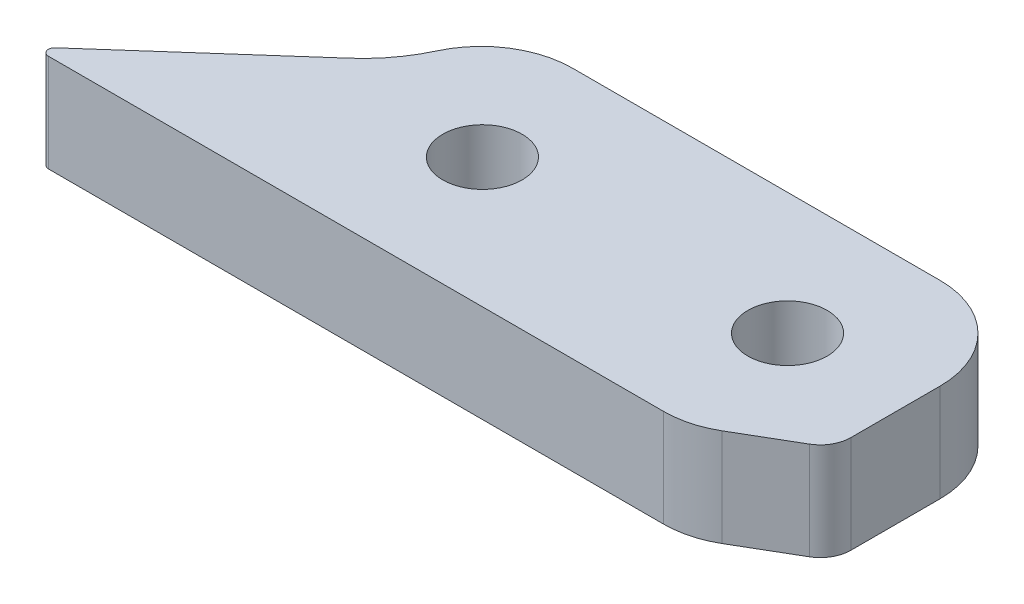
ISO-10303-21;
HEADER;
FILE_DESCRIPTION(('STEP AP214'),'2;1');
FILE_NAME('part.step','',(''),(''),'','','');
FILE_SCHEMA(('AUTOMOTIVE_DESIGN { 1 0 10303 214 1 1 1 1 }'));
ENDSEC;
DATA;
#1=APPLICATION_CONTEXT('core data for automotive mechanical design processes');
#2=APPLICATION_PROTOCOL_DEFINITION('international standard','automotive_design',2000,#1);
#3=PRODUCT_CONTEXT('',#1,'mechanical');
#4=PRODUCT('Part','Part','',(#3));
#5=PRODUCT_RELATED_PRODUCT_CATEGORY('part','',(#4));
#6=PRODUCT_DEFINITION_FORMATION('','',#4);
#7=PRODUCT_DEFINITION_CONTEXT('part definition',#1,'design');
#8=PRODUCT_DEFINITION('design','',#6,#7);
#9=PRODUCT_DEFINITION_SHAPE('','',#8);
#10=(LENGTH_UNIT() NAMED_UNIT(*) SI_UNIT(.MILLI.,.METRE.));
#11=(NAMED_UNIT(*) PLANE_ANGLE_UNIT() SI_UNIT($,.RADIAN.));
#12=(NAMED_UNIT(*) SI_UNIT($,.STERADIAN.) SOLID_ANGLE_UNIT());
#13=UNCERTAINTY_MEASURE_WITH_UNIT(LENGTH_MEASURE(1.E-05),#10,'distance_accuracy_value','');
#14=(GEOMETRIC_REPRESENTATION_CONTEXT(3) GLOBAL_UNCERTAINTY_ASSIGNED_CONTEXT((#13)) GLOBAL_UNIT_ASSIGNED_CONTEXT((#10,
#11,#12)) REPRESENTATION_CONTEXT('',''));
#15=CARTESIAN_POINT('',(0.,0.,0.));
#16=DIRECTION('',(0.,0.,1.));
#17=DIRECTION('',(1.,0.,0.));
#18=AXIS2_PLACEMENT_3D('',#15,#16,#17);
#19=CARTESIAN_POINT('',(0.,6.4,0.));
#20=DIRECTION('',(0.,1.,0.));
#21=DIRECTION('',(0.,0.,1.));
#22=AXIS2_PLACEMENT_3D('',#19,#20,#21);
#23=PLANE('',#22);
#24=CARTESIAN_POINT('',(28.,6.4,8.));
#25=DIRECTION('',(0.,1.,0.));
#26=DIRECTION('',(0.,0.,1.));
#27=AXIS2_PLACEMENT_3D('',#24,#25,#26);
#28=CIRCLE('',#27,2.6);
#29=CARTESIAN_POINT('',(28.,6.4,10.6));
#30=VERTEX_POINT('',#29);
#31=EDGE_CURVE('E220',#30,#30,#28,.T.);
#32=ORIENTED_EDGE('',*,*,#31,.F.);
#33=EDGE_LOOP('',(#32));
#34=FACE_BOUND('',#33,.T.);
#35=DIRECTION('',(0.863778900898433,0.,-0.503871025524086));
#36=VECTOR('',#35,1.);
#37=CARTESIAN_POINT('',(36.,6.4,13.));
#38=LINE('',#37,#36);
#39=CARTESIAN_POINT('',(31.4011313050447,6.4,15.6826734053906));
#40=VERTEX_POINT('',#39);
#41=CARTESIAN_POINT('',(35.0077420510482,6.4,13.5788171368886));
#42=VERTEX_POINT('',#41);
#43=EDGE_CURVE('E137',#40,#42,#38,.T.);
#44=ORIENTED_EDGE('',*,*,#43,.T.);
#45=CARTESIAN_POINT('',(34.,6.4,11.8512593350917));
#46=DIRECTION('',(0.,1.,0.));
#47=DIRECTION('',(0.,0.,1.));
#48=AXIS2_PLACEMENT_3D('',#45,#46,#47);
#49=CIRCLE('',#48,2.);
#50=CARTESIAN_POINT('',(36.,6.4,11.8512593350917));
#51=VERTEX_POINT('',#50);
#52=EDGE_CURVE('E11',#42,#51,#49,.T.);
#53=ORIENTED_EDGE('',*,*,#52,.T.);
#54=DIRECTION('',(0.,0.,-1.));
#55=VECTOR('',#54,1.);
#56=CARTESIAN_POINT('',(36.,6.4,13.));
#57=LINE('',#56,#55);
#58=CARTESIAN_POINT('',(36.,6.4,6.));
#59=VERTEX_POINT('',#58);
#60=EDGE_CURVE('E199',#51,#59,#57,.T.);
#61=ORIENTED_EDGE('',*,*,#60,.T.);
#62=CARTESIAN_POINT('',(30.,6.4,6.));
#63=DIRECTION('',(0.,1.,0.));
#64=DIRECTION('',(0.,0.,1.));
#65=AXIS2_PLACEMENT_3D('',#62,#63,#64);
#66=CIRCLE('',#65,6.);
#67=CARTESIAN_POINT('',(30.,6.4,0.));
#68=VERTEX_POINT('',#67);
#69=EDGE_CURVE('E162',#59,#68,#66,.T.);
#70=ORIENTED_EDGE('',*,*,#69,.T.);
#71=DIRECTION('',(-1.,0.,0.));
#72=VECTOR('',#71,1.);
#73=CARTESIAN_POINT('',(36.,6.4,0.));
#74=LINE('',#73,#72);
#75=CARTESIAN_POINT('',(5.91607978309962,6.4,0.));
#76=VERTEX_POINT('',#75);
#77=EDGE_CURVE('E139',#68,#76,#74,.T.);
#78=ORIENTED_EDGE('',*,*,#77,.T.);
#79=CARTESIAN_POINT('',(5.91607978309962,6.4,6.));
#80=DIRECTION('',(0.,1.,0.));
#81=DIRECTION('',(0.,0.,1.));
#82=AXIS2_PLACEMENT_3D('',#79,#80,#81);
#83=CIRCLE('',#82,6.);
#84=CARTESIAN_POINT('',(0.476752161081496,6.4,3.4674686536292));
#85=VERTEX_POINT('',#84);
#86=EDGE_CURVE('E159',#76,#85,#83,.T.);
#87=ORIENTED_EDGE('',*,*,#86,.T.);
#88=CARTESIAN_POINT('',(-8.58879387561537,6.4,-0.753416923655458));
#89=DIRECTION('',(0.,1.,0.));
#90=DIRECTION('',(0.,0.,1.));
#91=AXIS2_PLACEMENT_3D('',#88,#89,#90);
#92=CIRCLE('',#91,10.);
#93=CARTESIAN_POINT('',(-1.96305505358508,6.4,6.73654870124834));
#94=VERTEX_POINT('',#93);
#95=EDGE_CURVE('E181',#85,#94,#92,.F.);
#96=ORIENTED_EDGE('',*,*,#95,.T.);
#97=DIRECTION('',(-0.748996562490381,0.,0.662573882203029));
#98=VECTOR('',#97,1.);
#99=CARTESIAN_POINT('',(0.,6.4,5.));
#100=LINE('',#99,#98);
#101=CARTESIAN_POINT('',(-12.2091493804391,6.4,15.8004013750039));
#102=VERTEX_POINT('',#101);
#103=EDGE_CURVE('E153',#94,#102,#100,.T.);
#104=ORIENTED_EDGE('',*,*,#103,.T.);
#105=CARTESIAN_POINT('',(-11.9441198275579,6.4,16.1));
#106=DIRECTION('',(0.,1.,0.));
#107=DIRECTION('',(0.,0.,1.));
#108=AXIS2_PLACEMENT_3D('',#105,#106,#107);
#109=CIRCLE('',#108,0.4);
#110=CARTESIAN_POINT('',(-11.9441198275579,6.4,16.5));
#111=VERTEX_POINT('',#110);
#112=EDGE_CURVE('E190',#102,#111,#109,.T.);
#113=ORIENTED_EDGE('',*,*,#112,.T.);
#114=DIRECTION('',(1.,0.,0.));
#115=VECTOR('',#114,1.);
#116=CARTESIAN_POINT('',(-13.,6.4,16.5));
#117=LINE('',#116,#115);
#118=CARTESIAN_POINT('',(28.3779051519002,6.4,16.5));
#119=VERTEX_POINT('',#118);
#120=EDGE_CURVE('E238',#111,#119,#117,.T.);
#121=ORIENTED_EDGE('',*,*,#120,.T.);
#122=CARTESIAN_POINT('',(28.3779051519002,6.4,10.5));
#123=DIRECTION('',(0.,1.,0.));
#124=DIRECTION('',(0.,0.,1.));
#125=AXIS2_PLACEMENT_3D('',#122,#123,#124);
#126=CIRCLE('',#125,6.);
#127=EDGE_CURVE('E164',#119,#40,#126,.T.);
#128=ORIENTED_EDGE('',*,*,#127,.T.);
#129=EDGE_LOOP('',(#44,#53,#61,#70,#78,#87,#96,#104,#113,#121,#128));
#130=FACE_BOUND('',#129,.T.);
#131=CARTESIAN_POINT('',(8.,6.4,8.));
#132=DIRECTION('',(0.,1.,0.));
#133=DIRECTION('',(0.,0.,1.));
#134=AXIS2_PLACEMENT_3D('',#131,#132,#133);
#135=CIRCLE('',#134,2.6);
#136=CARTESIAN_POINT('',(8.,6.4,10.6));
#137=VERTEX_POINT('',#136);
#138=EDGE_CURVE('E230',#137,#137,#135,.T.);
#139=ORIENTED_EDGE('',*,*,#138,.F.);
#140=EDGE_LOOP('',(#139));
#141=FACE_BOUND('',#140,.T.);
#142=ADVANCED_FACE('F41',(#34,#130,#141),#23,.T.);
#143=CARTESIAN_POINT('',(0.,0.,0.));
#144=DIRECTION('',(0.,1.,0.));
#145=DIRECTION('',(0.,0.,1.));
#146=AXIS2_PLACEMENT_3D('',#143,#144,#145);
#147=PLANE('',#146);
#148=DIRECTION('',(0.,0.,-1.));
#149=VECTOR('',#148,1.);
#150=CARTESIAN_POINT('',(36.,0.,13.));
#151=LINE('',#150,#149);
#152=CARTESIAN_POINT('',(36.,0.,11.8512593350917));
#153=VERTEX_POINT('',#152);
#154=CARTESIAN_POINT('',(36.,0.,6.));
#155=VERTEX_POINT('',#154);
#156=EDGE_CURVE('E143',#153,#155,#151,.T.);
#157=ORIENTED_EDGE('',*,*,#156,.F.);
#158=CARTESIAN_POINT('',(34.,0.,11.8512593350917));
#159=DIRECTION('',(0.,1.,0.));
#160=DIRECTION('',(0.,0.,1.));
#161=AXIS2_PLACEMENT_3D('',#158,#159,#160);
#162=CIRCLE('',#161,2.);
#163=CARTESIAN_POINT('',(35.0077420510482,0.,13.5788171368886));
#164=VERTEX_POINT('',#163);
#165=EDGE_CURVE('E63',#153,#164,#162,.F.);
#166=ORIENTED_EDGE('',*,*,#165,.T.);
#167=DIRECTION('',(0.863778900898433,0.,-0.503871025524086));
#168=VECTOR('',#167,1.);
#169=CARTESIAN_POINT('',(36.,0.,13.));
#170=LINE('',#169,#168);
#171=CARTESIAN_POINT('',(31.4011313050447,0.,15.6826734053906));
#172=VERTEX_POINT('',#171);
#173=EDGE_CURVE('E136',#172,#164,#170,.T.);
#174=ORIENTED_EDGE('',*,*,#173,.F.);
#175=CARTESIAN_POINT('',(28.3779051519002,0.,10.5));
#176=DIRECTION('',(0.,1.,0.));
#177=DIRECTION('',(0.,0.,1.));
#178=AXIS2_PLACEMENT_3D('',#175,#176,#177);
#179=CIRCLE('',#178,6.);
#180=CARTESIAN_POINT('',(28.3779051519002,0.,16.5));
#181=VERTEX_POINT('',#180);
#182=EDGE_CURVE('E125',#172,#181,#179,.F.);
#183=ORIENTED_EDGE('',*,*,#182,.T.);
#184=DIRECTION('',(1.,0.,0.));
#185=VECTOR('',#184,1.);
#186=CARTESIAN_POINT('',(30.,0.,16.5));
#187=LINE('',#186,#185);
#188=CARTESIAN_POINT('',(-11.9441198275579,0.,16.5));
#189=VERTEX_POINT('',#188);
#190=EDGE_CURVE('E144',#189,#181,#187,.T.);
#191=ORIENTED_EDGE('',*,*,#190,.F.);
#192=CARTESIAN_POINT('',(-11.9441198275579,0.,16.1));
#193=DIRECTION('',(0.,1.,0.));
#194=DIRECTION('',(0.,0.,1.));
#195=AXIS2_PLACEMENT_3D('',#192,#193,#194);
#196=CIRCLE('',#195,0.4);
#197=CARTESIAN_POINT('',(-12.2091493804391,0.,15.8004013750039));
#198=VERTEX_POINT('',#197);
#199=EDGE_CURVE('E186',#189,#198,#196,.F.);
#200=ORIENTED_EDGE('',*,*,#199,.T.);
#201=DIRECTION('',(-0.748996562490381,0.,0.662573882203029));
#202=VECTOR('',#201,1.);
#203=CARTESIAN_POINT('',(0.,0.,5.));
#204=LINE('',#203,#202);
#205=CARTESIAN_POINT('',(-1.96305505358508,0.,6.73654870124834));
#206=VERTEX_POINT('',#205);
#207=EDGE_CURVE('E148',#206,#198,#204,.T.);
#208=ORIENTED_EDGE('',*,*,#207,.F.);
#209=CARTESIAN_POINT('',(-8.58879387561537,0.,-0.753416923655458));
#210=DIRECTION('',(0.,1.,0.));
#211=DIRECTION('',(0.,0.,1.));
#212=AXIS2_PLACEMENT_3D('',#209,#210,#211);
#213=CIRCLE('',#212,10.);
#214=CARTESIAN_POINT('',(0.476752161081496,0.,3.4674686536292));
#215=VERTEX_POINT('',#214);
#216=EDGE_CURVE('E179',#206,#215,#213,.T.);
#217=ORIENTED_EDGE('',*,*,#216,.T.);
#218=CARTESIAN_POINT('',(5.91607978309962,0.,6.));
#219=DIRECTION('',(0.,1.,0.));
#220=DIRECTION('',(0.,0.,1.));
#221=AXIS2_PLACEMENT_3D('',#218,#219,#220);
#222=CIRCLE('',#221,6.);
#223=CARTESIAN_POINT('',(5.91607978309962,0.,0.));
#224=VERTEX_POINT('',#223);
#225=EDGE_CURVE('E138',#215,#224,#222,.F.);
#226=ORIENTED_EDGE('',*,*,#225,.T.);
#227=DIRECTION('',(-1.,0.,0.));
#228=VECTOR('',#227,1.);
#229=CARTESIAN_POINT('',(36.,0.,0.));
#230=LINE('',#229,#228);
#231=CARTESIAN_POINT('',(30.,0.,0.));
#232=VERTEX_POINT('',#231);
#233=EDGE_CURVE('E146',#232,#224,#230,.T.);
#234=ORIENTED_EDGE('',*,*,#233,.F.);
#235=CARTESIAN_POINT('',(30.,0.,6.));
#236=DIRECTION('',(0.,1.,0.));
#237=DIRECTION('',(0.,0.,1.));
#238=AXIS2_PLACEMENT_3D('',#235,#236,#237);
#239=CIRCLE('',#238,6.);
#240=EDGE_CURVE('E133',#232,#155,#239,.F.);
#241=ORIENTED_EDGE('',*,*,#240,.T.);
#242=EDGE_LOOP('',(#157,#166,#174,#183,#191,#200,#208,#217,#226,#234,#241));
#243=FACE_BOUND('',#242,.T.);
#244=CARTESIAN_POINT('',(28.,0.,8.));
#245=DIRECTION('',(0.,1.,0.));
#246=DIRECTION('',(0.,0.,1.));
#247=AXIS2_PLACEMENT_3D('',#244,#245,#246);
#248=CIRCLE('',#247,2.6);
#249=CARTESIAN_POINT('',(28.,0.,10.6));
#250=VERTEX_POINT('',#249);
#251=EDGE_CURVE('E225',#250,#250,#248,.T.);
#252=ORIENTED_EDGE('',*,*,#251,.T.);
#253=EDGE_LOOP('',(#252));
#254=FACE_BOUND('',#253,.T.);
#255=CARTESIAN_POINT('',(8.,0.,8.));
#256=DIRECTION('',(0.,1.,0.));
#257=DIRECTION('',(0.,0.,1.));
#258=AXIS2_PLACEMENT_3D('',#255,#256,#257);
#259=CIRCLE('',#258,2.6);
#260=CARTESIAN_POINT('',(8.,0.,10.6));
#261=VERTEX_POINT('',#260);
#262=EDGE_CURVE('E233',#261,#261,#259,.T.);
#263=ORIENTED_EDGE('',*,*,#262,.T.);
#264=EDGE_LOOP('',(#263));
#265=FACE_BOUND('',#264,.T.);
#266=ADVANCED_FACE('F141',(#243,#254,#265),#147,.F.);
#267=CARTESIAN_POINT('',(0.,6.4,5.));
#268=DIRECTION('',(0.662573882203029,0.,0.74899656249038));
#269=DIRECTION('',(0.74899656249038,0.,-0.662573882203029));
#270=AXIS2_PLACEMENT_3D('',#267,#268,#269);
#271=PLANE('',#270);
#272=ORIENTED_EDGE('',*,*,#207,.T.);
#273=DIRECTION('',(0.,-1.,0.));
#274=VECTOR('',#273,1.);
#275=CARTESIAN_POINT('',(-12.2091493804391,6.4,15.8004013750039));
#276=LINE('',#275,#274);
#277=EDGE_CURVE('E188',#198,#102,#276,.F.);
#278=ORIENTED_EDGE('',*,*,#277,.T.);
#279=ORIENTED_EDGE('',*,*,#103,.F.);
#280=DIRECTION('',(0.,-1.,0.));
#281=VECTOR('',#280,1.);
#282=CARTESIAN_POINT('',(-1.96305505358508,6.4,6.73654870124834));
#283=LINE('',#282,#281);
#284=EDGE_CURVE('E174',#94,#206,#283,.T.);
#285=ORIENTED_EDGE('',*,*,#284,.T.);
#286=EDGE_LOOP('',(#272,#278,#279,#285));
#287=FACE_BOUND('',#286,.T.);
#288=ADVANCED_FACE('F253',(#287),#271,.F.);
#289=CARTESIAN_POINT('',(30.,6.4,16.5));
#290=DIRECTION('',(0.,0.,-1.));
#291=DIRECTION('',(-1.,0.,0.));
#292=AXIS2_PLACEMENT_3D('',#289,#290,#291);
#293=PLANE('',#292);
#294=ORIENTED_EDGE('',*,*,#120,.F.);
#295=DIRECTION('',(0.,-1.,0.));
#296=VECTOR('',#295,1.);
#297=CARTESIAN_POINT('',(-11.9441198275579,6.4,16.5));
#298=LINE('',#297,#296);
#299=EDGE_CURVE('E183',#111,#189,#298,.T.);
#300=ORIENTED_EDGE('',*,*,#299,.T.);
#301=ORIENTED_EDGE('',*,*,#190,.T.);
#302=DIRECTION('',(0.,-1.,0.));
#303=VECTOR('',#302,1.);
#304=CARTESIAN_POINT('',(28.3779051519002,6.4,16.5));
#305=LINE('',#304,#303);
#306=EDGE_CURVE('E131',#181,#119,#305,.F.);
#307=ORIENTED_EDGE('',*,*,#306,.T.);
#308=EDGE_LOOP('',(#294,#300,#301,#307));
#309=FACE_BOUND('',#308,.T.);
#310=ADVANCED_FACE('F264',(#309),#293,.F.);
#311=CARTESIAN_POINT('',(36.,6.4,13.));
#312=DIRECTION('',(-0.503871025524086,0.,-0.863778900898433));
#313=DIRECTION('',(-0.863778900898433,0.,0.503871025524086));
#314=AXIS2_PLACEMENT_3D('',#311,#312,#313);
#315=PLANE('',#314);
#316=ORIENTED_EDGE('',*,*,#173,.T.);
#317=DIRECTION('',(0.,-1.,0.));
#318=VECTOR('',#317,1.);
#319=CARTESIAN_POINT('',(35.0077420510482,6.4,13.5788171368886));
#320=LINE('',#319,#318);
#321=EDGE_CURVE('E49',#164,#42,#320,.F.);
#322=ORIENTED_EDGE('',*,*,#321,.T.);
#323=ORIENTED_EDGE('',*,*,#43,.F.);
#324=DIRECTION('',(0.,-1.,0.));
#325=VECTOR('',#324,1.);
#326=CARTESIAN_POINT('',(31.4011313050447,6.4,15.6826734053906));
#327=LINE('',#326,#325);
#328=EDGE_CURVE('E129',#40,#172,#327,.T.);
#329=ORIENTED_EDGE('',*,*,#328,.T.);
#330=EDGE_LOOP('',(#316,#322,#323,#329));
#331=FACE_BOUND('',#330,.T.);
#332=ADVANCED_FACE('F135',(#331),#315,.F.);
#333=CARTESIAN_POINT('',(36.,6.4,13.));
#334=DIRECTION('',(-1.,0.,0.));
#335=DIRECTION('',(0.,0.,1.));
#336=AXIS2_PLACEMENT_3D('',#333,#334,#335);
#337=PLANE('',#336);
#338=ORIENTED_EDGE('',*,*,#60,.F.);
#339=DIRECTION('',(0.,-1.,0.));
#340=VECTOR('',#339,1.);
#341=CARTESIAN_POINT('',(36.,6.4,11.8512593350917));
#342=LINE('',#341,#340);
#343=EDGE_CURVE('E192',#51,#153,#342,.T.);
#344=ORIENTED_EDGE('',*,*,#343,.T.);
#345=ORIENTED_EDGE('',*,*,#156,.T.);
#346=DIRECTION('',(0.,-1.,0.));
#347=VECTOR('',#346,1.);
#348=CARTESIAN_POINT('',(36.,6.4,6.));
#349=LINE('',#348,#347);
#350=EDGE_CURVE('E171',#155,#59,#349,.F.);
#351=ORIENTED_EDGE('',*,*,#350,.T.);
#352=EDGE_LOOP('',(#338,#344,#345,#351));
#353=FACE_BOUND('',#352,.T.);
#354=ADVANCED_FACE('F198',(#353),#337,.F.);
#355=CARTESIAN_POINT('',(36.,6.4,0.));
#356=DIRECTION('',(0.,0.,1.));
#357=DIRECTION('',(1.,0.,0.));
#358=AXIS2_PLACEMENT_3D('',#355,#356,#357);
#359=PLANE('',#358);
#360=ORIENTED_EDGE('',*,*,#77,.F.);
#361=DIRECTION('',(0.,-1.,0.));
#362=VECTOR('',#361,1.);
#363=CARTESIAN_POINT('',(30.,6.4,0.));
#364=LINE('',#363,#362);
#365=EDGE_CURVE('E168',#68,#232,#364,.T.);
#366=ORIENTED_EDGE('',*,*,#365,.T.);
#367=ORIENTED_EDGE('',*,*,#233,.T.);
#368=DIRECTION('',(0.,-1.,0.));
#369=VECTOR('',#368,1.);
#370=CARTESIAN_POINT('',(5.91607978309962,6.4,0.));
#371=LINE('',#370,#369);
#372=EDGE_CURVE('E166',#224,#76,#371,.F.);
#373=ORIENTED_EDGE('',*,*,#372,.T.);
#374=EDGE_LOOP('',(#360,#366,#367,#373));
#375=FACE_BOUND('',#374,.T.);
#376=ADVANCED_FACE('F214',(#375),#359,.F.);
#377=CARTESIAN_POINT('',(28.,6.4,8.));
#378=DIRECTION('',(0.,-1.,0.));
#379=DIRECTION('',(0.,0.,-1.));
#380=AXIS2_PLACEMENT_3D('',#377,#378,#379);
#381=CYLINDRICAL_SURFACE('',#380,2.6);
#382=ORIENTED_EDGE('',*,*,#31,.T.);
#383=EDGE_LOOP('',(#382));
#384=FACE_BOUND('',#383,.T.);
#385=ORIENTED_EDGE('',*,*,#251,.F.);
#386=EDGE_LOOP('',(#385));
#387=FACE_BOUND('',#386,.T.);
#388=ADVANCED_FACE('F256',(#384,#387),#381,.F.);
#389=CARTESIAN_POINT('',(8.,6.4,8.));
#390=DIRECTION('',(0.,-1.,0.));
#391=DIRECTION('',(0.,0.,-1.));
#392=AXIS2_PLACEMENT_3D('',#389,#390,#391);
#393=CYLINDRICAL_SURFACE('',#392,2.6);
#394=ORIENTED_EDGE('',*,*,#138,.T.);
#395=EDGE_LOOP('',(#394));
#396=FACE_BOUND('',#395,.T.);
#397=ORIENTED_EDGE('',*,*,#262,.F.);
#398=EDGE_LOOP('',(#397));
#399=FACE_BOUND('',#398,.T.);
#400=ADVANCED_FACE('F272',(#396,#399),#393,.F.);
#401=CARTESIAN_POINT('',(28.3779051519002,6.4,10.5));
#402=DIRECTION('',(0.,-1.,0.));
#403=DIRECTION('',(0.,0.,-1.));
#404=AXIS2_PLACEMENT_3D('',#401,#402,#403);
#405=CYLINDRICAL_SURFACE('',#404,6.);
#406=ORIENTED_EDGE('',*,*,#127,.F.);
#407=ORIENTED_EDGE('',*,*,#306,.F.);
#408=ORIENTED_EDGE('',*,*,#182,.F.);
#409=ORIENTED_EDGE('',*,*,#328,.F.);
#410=EDGE_LOOP('',(#406,#407,#408,#409));
#411=FACE_BOUND('',#410,.T.);
#412=ADVANCED_FACE('F128',(#411),#405,.T.);
#413=CARTESIAN_POINT('',(30.,6.4,6.));
#414=DIRECTION('',(0.,-1.,0.));
#415=DIRECTION('',(0.,0.,-1.));
#416=AXIS2_PLACEMENT_3D('',#413,#414,#415);
#417=CYLINDRICAL_SURFACE('',#416,6.);
#418=ORIENTED_EDGE('',*,*,#69,.F.);
#419=ORIENTED_EDGE('',*,*,#350,.F.);
#420=ORIENTED_EDGE('',*,*,#240,.F.);
#421=ORIENTED_EDGE('',*,*,#365,.F.);
#422=EDGE_LOOP('',(#418,#419,#420,#421));
#423=FACE_BOUND('',#422,.T.);
#424=ADVANCED_FACE('F207',(#423),#417,.T.);
#425=CARTESIAN_POINT('',(5.91607978309962,6.4,6.));
#426=DIRECTION('',(0.,-1.,0.));
#427=DIRECTION('',(0.,0.,-1.));
#428=AXIS2_PLACEMENT_3D('',#425,#426,#427);
#429=CYLINDRICAL_SURFACE('',#428,6.);
#430=ORIENTED_EDGE('',*,*,#225,.F.);
#431=DIRECTION('',(0.,-1.,0.));
#432=VECTOR('',#431,1.);
#433=CARTESIAN_POINT('',(0.476752161081495,6.4,3.4674686536292));
#434=LINE('',#433,#432);
#435=EDGE_CURVE('E177',#215,#85,#434,.F.);
#436=ORIENTED_EDGE('',*,*,#435,.T.);
#437=ORIENTED_EDGE('',*,*,#86,.F.);
#438=ORIENTED_EDGE('',*,*,#372,.F.);
#439=EDGE_LOOP('',(#430,#436,#437,#438));
#440=FACE_BOUND('',#439,.T.);
#441=ADVANCED_FACE('F275',(#440),#429,.T.);
#442=CARTESIAN_POINT('',(-8.58879387561537,6.4,-0.753416923655458));
#443=DIRECTION('',(0.,-1.,0.));
#444=DIRECTION('',(0.,0.,-1.));
#445=AXIS2_PLACEMENT_3D('',#442,#443,#444);
#446=CYLINDRICAL_SURFACE('',#445,10.);
#447=ORIENTED_EDGE('',*,*,#95,.F.);
#448=ORIENTED_EDGE('',*,*,#435,.F.);
#449=ORIENTED_EDGE('',*,*,#216,.F.);
#450=ORIENTED_EDGE('',*,*,#284,.F.);
#451=EDGE_LOOP('',(#447,#448,#449,#450));
#452=FACE_BOUND('',#451,.T.);
#453=ADVANCED_FACE('F245',(#452),#446,.F.);
#454=CARTESIAN_POINT('',(-11.9441198275579,6.4,16.1));
#455=DIRECTION('',(0.,-1.,0.));
#456=DIRECTION('',(0.,0.,-1.));
#457=AXIS2_PLACEMENT_3D('',#454,#455,#456);
#458=CYLINDRICAL_SURFACE('',#457,0.4);
#459=ORIENTED_EDGE('',*,*,#112,.F.);
#460=ORIENTED_EDGE('',*,*,#277,.F.);
#461=ORIENTED_EDGE('',*,*,#199,.F.);
#462=ORIENTED_EDGE('',*,*,#299,.F.);
#463=EDGE_LOOP('',(#459,#460,#461,#462));
#464=FACE_BOUND('',#463,.T.);
#465=ADVANCED_FACE('F240',(#464),#458,.T.);
#466=CARTESIAN_POINT('',(34.,6.4,11.8512593350917));
#467=DIRECTION('',(0.,-1.,0.));
#468=DIRECTION('',(0.,0.,-1.));
#469=AXIS2_PLACEMENT_3D('',#466,#467,#468);
#470=CYLINDRICAL_SURFACE('',#469,2.);
#471=ORIENTED_EDGE('',*,*,#52,.F.);
#472=ORIENTED_EDGE('',*,*,#321,.F.);
#473=ORIENTED_EDGE('',*,*,#165,.F.);
#474=ORIENTED_EDGE('',*,*,#343,.F.);
#475=EDGE_LOOP('',(#471,#472,#473,#474));
#476=FACE_BOUND('',#475,.T.);
#477=ADVANCED_FACE('F43',(#476),#470,.T.);
#478=CLOSED_SHELL('',(#142,#266,#288,#310,#332,#354,#376,#388,#400,#412,#424,#441,#453,#465,#477));
#479=MANIFOLD_SOLID_BREP('B2',#478);
#480=ADVANCED_BREP_SHAPE_REPRESENTATION('',(#18,#479),#14);
#481=SHAPE_DEFINITION_REPRESENTATION(#9,#480);
ENDSEC;
END-ISO-10303-21;
